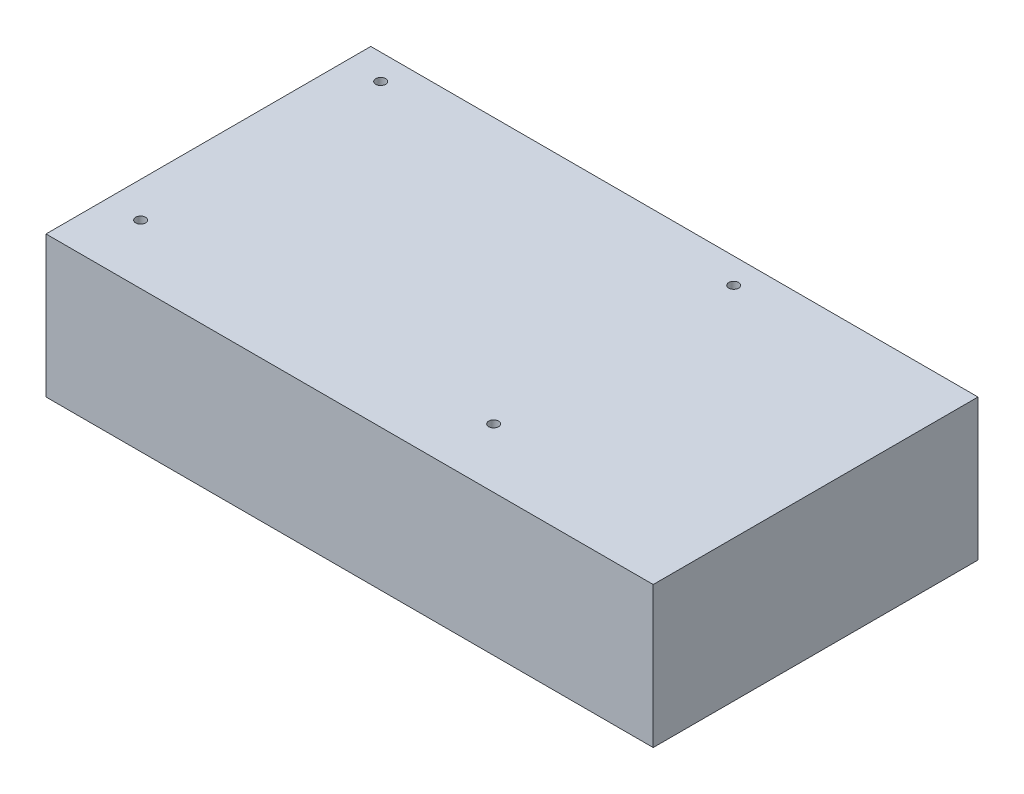
ISO-10303-21;
HEADER;
FILE_DESCRIPTION(('STEP AP214'),'2;1');
FILE_NAME('part.step','',(''),(''),'','','');
FILE_SCHEMA(('AUTOMOTIVE_DESIGN { 1 0 10303 214 1 1 1 1 }'));
ENDSEC;
DATA;
#1=APPLICATION_CONTEXT('core data for automotive mechanical design processes');
#2=APPLICATION_PROTOCOL_DEFINITION('international standard','automotive_design',2000,#1);
#3=PRODUCT_CONTEXT('',#1,'mechanical');
#4=PRODUCT('Part','Part','',(#3));
#5=PRODUCT_RELATED_PRODUCT_CATEGORY('part','',(#4));
#6=PRODUCT_DEFINITION_FORMATION('','',#4);
#7=PRODUCT_DEFINITION_CONTEXT('part definition',#1,'design');
#8=PRODUCT_DEFINITION('design','',#6,#7);
#9=PRODUCT_DEFINITION_SHAPE('','',#8);
#10=(LENGTH_UNIT() NAMED_UNIT(*) SI_UNIT(.MILLI.,.METRE.));
#11=(NAMED_UNIT(*) PLANE_ANGLE_UNIT() SI_UNIT($,.RADIAN.));
#12=(NAMED_UNIT(*) SI_UNIT($,.STERADIAN.) SOLID_ANGLE_UNIT());
#13=UNCERTAINTY_MEASURE_WITH_UNIT(LENGTH_MEASURE(1.E-05),#10,'distance_accuracy_value','');
#14=(GEOMETRIC_REPRESENTATION_CONTEXT(3) GLOBAL_UNCERTAINTY_ASSIGNED_CONTEXT((#13)) GLOBAL_UNIT_ASSIGNED_CONTEXT((#10,
#11,#12)) REPRESENTATION_CONTEXT('',''));
#15=CARTESIAN_POINT('',(0.,0.,0.));
#16=DIRECTION('',(0.,0.,1.));
#17=DIRECTION('',(1.,0.,0.));
#18=AXIS2_PLACEMENT_3D('',#15,#16,#17);
#19=CARTESIAN_POINT('',(-56.686460807601,50.,-50.813539192399));
#20=DIRECTION('',(1.,0.,0.));
#21=DIRECTION('',(0.,0.,-1.));
#22=AXIS2_PLACEMENT_3D('',#19,#20,#21);
#23=PLANE('',#22);
#24=DIRECTION('',(0.,0.,1.));
#25=VECTOR('',#24,1.);
#26=CARTESIAN_POINT('',(-56.686460807601,0.,-50.813539192399));
#27=LINE('',#26,#25);
#28=CARTESIAN_POINT('',(-56.686460807601,0.,-50.813539192399));
#29=VERTEX_POINT('',#28);
#30=CARTESIAN_POINT('',(-56.686460807601,0.,64.186460807601));
#31=VERTEX_POINT('',#30);
#32=EDGE_CURVE('E98',#29,#31,#27,.T.);
#33=ORIENTED_EDGE('',*,*,#32,.T.);
#34=DIRECTION('',(0.,-1.,0.));
#35=VECTOR('',#34,1.);
#36=CARTESIAN_POINT('',(-56.686460807601,50.,64.186460807601));
#37=LINE('',#36,#35);
#38=CARTESIAN_POINT('',(-56.686460807601,50.,64.186460807601));
#39=VERTEX_POINT('',#38);
#40=EDGE_CURVE('E11',#39,#31,#37,.T.);
#41=ORIENTED_EDGE('',*,*,#40,.F.);
#42=DIRECTION('',(0.,0.,1.));
#43=VECTOR('',#42,1.);
#44=CARTESIAN_POINT('',(-56.686460807601,50.,-50.813539192399));
#45=LINE('',#44,#43);
#46=CARTESIAN_POINT('',(-56.686460807601,50.,-50.813539192399));
#47=VERTEX_POINT('',#46);
#48=EDGE_CURVE('E86',#47,#39,#45,.T.);
#49=ORIENTED_EDGE('',*,*,#48,.F.);
#50=DIRECTION('',(0.,-1.,0.));
#51=VECTOR('',#50,1.);
#52=CARTESIAN_POINT('',(-56.686460807601,50.,-50.813539192399));
#53=LINE('',#52,#51);
#54=EDGE_CURVE('E94',#47,#29,#53,.T.);
#55=ORIENTED_EDGE('',*,*,#54,.T.);
#56=EDGE_LOOP('',(#33,#41,#49,#55));
#57=FACE_BOUND('',#56,.T.);
#58=ADVANCED_FACE('F35',(#57),#23,.F.);
#59=CARTESIAN_POINT('',(-56.686460807601,50.,64.186460807601));
#60=DIRECTION('',(0.,0.,-1.));
#61=DIRECTION('',(-1.,0.,0.));
#62=AXIS2_PLACEMENT_3D('',#59,#60,#61);
#63=PLANE('',#62);
#64=DIRECTION('',(1.,0.,0.));
#65=VECTOR('',#64,1.);
#66=CARTESIAN_POINT('',(-56.686460807601,0.,64.186460807601));
#67=LINE('',#66,#65);
#68=CARTESIAN_POINT('',(158.313539192399,0.,64.186460807601));
#69=VERTEX_POINT('',#68);
#70=EDGE_CURVE('E90',#31,#69,#67,.T.);
#71=ORIENTED_EDGE('',*,*,#70,.T.);
#72=DIRECTION('',(0.,-1.,0.));
#73=VECTOR('',#72,1.);
#74=CARTESIAN_POINT('',(158.313539192399,50.,64.186460807601));
#75=LINE('',#74,#73);
#76=CARTESIAN_POINT('',(158.313539192399,50.,64.186460807601));
#77=VERTEX_POINT('',#76);
#78=EDGE_CURVE('E43',#77,#69,#75,.T.);
#79=ORIENTED_EDGE('',*,*,#78,.F.);
#80=DIRECTION('',(1.,0.,0.));
#81=VECTOR('',#80,1.);
#82=CARTESIAN_POINT('',(-56.686460807601,50.,64.186460807601));
#83=LINE('',#82,#81);
#84=EDGE_CURVE('E81',#39,#77,#83,.T.);
#85=ORIENTED_EDGE('',*,*,#84,.F.);
#86=ORIENTED_EDGE('',*,*,#40,.T.);
#87=EDGE_LOOP('',(#71,#79,#85,#86));
#88=FACE_BOUND('',#87,.T.);
#89=ADVANCED_FACE('F89',(#88),#63,.F.);
#90=CARTESIAN_POINT('',(158.313539192399,50.,-50.813539192399));
#91=DIRECTION('',(-1.,0.,0.));
#92=DIRECTION('',(0.,0.,1.));
#93=AXIS2_PLACEMENT_3D('',#90,#91,#92);
#94=PLANE('',#93);
#95=DIRECTION('',(0.,0.,-1.));
#96=VECTOR('',#95,1.);
#97=CARTESIAN_POINT('',(158.313539192399,0.,-50.813539192399));
#98=LINE('',#97,#96);
#99=CARTESIAN_POINT('',(158.313539192399,0.,-50.813539192399));
#100=VERTEX_POINT('',#99);
#101=EDGE_CURVE('E68',#69,#100,#98,.T.);
#102=ORIENTED_EDGE('',*,*,#101,.T.);
#103=DIRECTION('',(0.,-1.,0.));
#104=VECTOR('',#103,1.);
#105=CARTESIAN_POINT('',(158.313539192399,50.,-50.813539192399));
#106=LINE('',#105,#104);
#107=CARTESIAN_POINT('',(158.313539192399,50.,-50.813539192399));
#108=VERTEX_POINT('',#107);
#109=EDGE_CURVE('E91',#108,#100,#106,.T.);
#110=ORIENTED_EDGE('',*,*,#109,.F.);
#111=DIRECTION('',(0.,0.,-1.));
#112=VECTOR('',#111,1.);
#113=CARTESIAN_POINT('',(158.313539192399,50.,-50.813539192399));
#114=LINE('',#113,#112);
#115=EDGE_CURVE('E84',#77,#108,#114,.T.);
#116=ORIENTED_EDGE('',*,*,#115,.F.);
#117=ORIENTED_EDGE('',*,*,#78,.T.);
#118=EDGE_LOOP('',(#102,#110,#116,#117));
#119=FACE_BOUND('',#118,.T.);
#120=ADVANCED_FACE('F92',(#119),#94,.F.);
#121=CARTESIAN_POINT('',(-56.686460807601,50.,-50.813539192399));
#122=DIRECTION('',(0.,0.,1.));
#123=DIRECTION('',(1.,0.,0.));
#124=AXIS2_PLACEMENT_3D('',#121,#122,#123);
#125=PLANE('',#124);
#126=DIRECTION('',(-1.,0.,0.));
#127=VECTOR('',#126,1.);
#128=CARTESIAN_POINT('',(-56.686460807601,0.,-50.813539192399));
#129=LINE('',#128,#127);
#130=EDGE_CURVE('E74',#100,#29,#129,.T.);
#131=ORIENTED_EDGE('',*,*,#130,.T.);
#132=ORIENTED_EDGE('',*,*,#54,.F.);
#133=DIRECTION('',(-1.,0.,0.));
#134=VECTOR('',#133,1.);
#135=CARTESIAN_POINT('',(-56.686460807601,50.,-50.813539192399));
#136=LINE('',#135,#134);
#137=EDGE_CURVE('E51',#108,#47,#136,.T.);
#138=ORIENTED_EDGE('',*,*,#137,.F.);
#139=ORIENTED_EDGE('',*,*,#109,.T.);
#140=EDGE_LOOP('',(#131,#132,#138,#139));
#141=FACE_BOUND('',#140,.T.);
#142=ADVANCED_FACE('F106',(#141),#125,.F.);
#143=CARTESIAN_POINT('',(0.,50.,0.));
#144=DIRECTION('',(0.,1.,0.));
#145=DIRECTION('',(0.,0.,1.));
#146=AXIS2_PLACEMENT_3D('',#143,#144,#145);
#147=PLANE('',#146);
#148=CARTESIAN_POINT('',(80.813539192399,50.,-41.813539192399));
#149=DIRECTION('',(0.,1.,0.));
#150=DIRECTION('',(0.,0.,1.));
#151=AXIS2_PLACEMENT_3D('',#148,#149,#150);
#152=CIRCLE('',#151,1.75);
#153=CARTESIAN_POINT('',(80.813539192399,50.,-40.0635391923991));
#154=VERTEX_POINT('',#153);
#155=EDGE_CURVE('E118',#154,#154,#152,.T.);
#156=ORIENTED_EDGE('',*,*,#155,.F.);
#157=EDGE_LOOP('',(#156));
#158=FACE_BOUND('',#157,.T.);
#159=CARTESIAN_POINT('',(80.813539192399,50.,43.186460807601));
#160=DIRECTION('',(0.,1.,0.));
#161=DIRECTION('',(0.,0.,1.));
#162=AXIS2_PLACEMENT_3D('',#159,#160,#161);
#163=CIRCLE('',#162,1.75);
#164=CARTESIAN_POINT('',(80.813539192399,50.,44.936460807601));
#165=VERTEX_POINT('',#164);
#166=EDGE_CURVE('E124',#165,#165,#163,.T.);
#167=ORIENTED_EDGE('',*,*,#166,.F.);
#168=EDGE_LOOP('',(#167));
#169=FACE_BOUND('',#168,.T.);
#170=CARTESIAN_POINT('',(-44.186460807601,50.,43.186460807601));
#171=DIRECTION('',(0.,1.,0.));
#172=DIRECTION('',(0.,0.,1.));
#173=AXIS2_PLACEMENT_3D('',#170,#171,#172);
#174=CIRCLE('',#173,1.75);
#175=CARTESIAN_POINT('',(-44.186460807601,50.,44.936460807601));
#176=VERTEX_POINT('',#175);
#177=EDGE_CURVE('E130',#176,#176,#174,.T.);
#178=ORIENTED_EDGE('',*,*,#177,.F.);
#179=EDGE_LOOP('',(#178));
#180=FACE_BOUND('',#179,.T.);
#181=CARTESIAN_POINT('',(-44.186460807601,50.,-41.813539192399));
#182=DIRECTION('',(0.,1.,0.));
#183=DIRECTION('',(0.,0.,1.));
#184=AXIS2_PLACEMENT_3D('',#181,#182,#183);
#185=CIRCLE('',#184,1.75);
#186=CARTESIAN_POINT('',(-44.186460807601,50.,-40.063539192399));
#187=VERTEX_POINT('',#186);
#188=EDGE_CURVE('E112',#187,#187,#185,.T.);
#189=ORIENTED_EDGE('',*,*,#188,.F.);
#190=EDGE_LOOP('',(#189));
#191=FACE_BOUND('',#190,.T.);
#192=ORIENTED_EDGE('',*,*,#48,.T.);
#193=ORIENTED_EDGE('',*,*,#84,.T.);
#194=ORIENTED_EDGE('',*,*,#115,.T.);
#195=ORIENTED_EDGE('',*,*,#137,.T.);
#196=EDGE_LOOP('',(#192,#193,#194,#195));
#197=FACE_BOUND('',#196,.T.);
#198=ADVANCED_FACE('F82',(#158,#169,#180,#191,#197),#147,.T.);
#199=CARTESIAN_POINT('',(0.,0.,0.));
#200=DIRECTION('',(0.,1.,0.));
#201=DIRECTION('',(0.,0.,1.));
#202=AXIS2_PLACEMENT_3D('',#199,#200,#201);
#203=PLANE('',#202);
#204=ORIENTED_EDGE('',*,*,#32,.F.);
#205=ORIENTED_EDGE('',*,*,#130,.F.);
#206=ORIENTED_EDGE('',*,*,#101,.F.);
#207=ORIENTED_EDGE('',*,*,#70,.F.);
#208=EDGE_LOOP('',(#204,#205,#206,#207));
#209=FACE_BOUND('',#208,.T.);
#210=ADVANCED_FACE('F109',(#209),#203,.F.);
#211=CARTESIAN_POINT('',(-44.186460807601,45.,-41.813539192399));
#212=DIRECTION('',(0.,1.,0.));
#213=DIRECTION('',(0.,0.,1.));
#214=AXIS2_PLACEMENT_3D('',#211,#212,#213);
#215=CYLINDRICAL_SURFACE('',#214,1.75);
#216=CARTESIAN_POINT('',(-44.186460807601,45.,-41.813539192399));
#217=DIRECTION('',(0.,1.,0.));
#218=DIRECTION('',(0.,0.,1.));
#219=AXIS2_PLACEMENT_3D('',#216,#217,#218);
#220=CIRCLE('',#219,1.75);
#221=CARTESIAN_POINT('',(-44.186460807601,45.,-40.063539192399));
#222=VERTEX_POINT('',#221);
#223=EDGE_CURVE('E101',#222,#222,#220,.T.);
#224=ORIENTED_EDGE('',*,*,#223,.F.);
#225=EDGE_LOOP('',(#224));
#226=FACE_BOUND('',#225,.T.);
#227=ORIENTED_EDGE('',*,*,#188,.T.);
#228=EDGE_LOOP('',(#227));
#229=FACE_BOUND('',#228,.T.);
#230=ADVANCED_FACE('F151',(#226,#229),#215,.F.);
#231=CARTESIAN_POINT('',(-44.186460807601,45.,-41.813539192399));
#232=DIRECTION('',(0.,1.,0.));
#233=DIRECTION('',(0.,0.,1.));
#234=AXIS2_PLACEMENT_3D('',#231,#232,#233);
#235=PLANE('',#234);
#236=ORIENTED_EDGE('',*,*,#223,.T.);
#237=EDGE_LOOP('',(#236));
#238=FACE_BOUND('',#237,.T.);
#239=ADVANCED_FACE('F141',(#238),#235,.T.);
#240=CARTESIAN_POINT('',(-44.186460807601,45.,43.186460807601));
#241=DIRECTION('',(0.,1.,0.));
#242=DIRECTION('',(0.,0.,1.));
#243=AXIS2_PLACEMENT_3D('',#240,#241,#242);
#244=CYLINDRICAL_SURFACE('',#243,1.75);
#245=CARTESIAN_POINT('',(-44.186460807601,45.,43.186460807601));
#246=DIRECTION('',(0.,1.,0.));
#247=DIRECTION('',(0.,0.,1.));
#248=AXIS2_PLACEMENT_3D('',#245,#246,#247);
#249=CIRCLE('',#248,1.75);
#250=CARTESIAN_POINT('',(-44.186460807601,45.,44.936460807601));
#251=VERTEX_POINT('',#250);
#252=EDGE_CURVE('E115',#251,#251,#249,.T.);
#253=ORIENTED_EDGE('',*,*,#252,.F.);
#254=EDGE_LOOP('',(#253));
#255=FACE_BOUND('',#254,.T.);
#256=ORIENTED_EDGE('',*,*,#177,.T.);
#257=EDGE_LOOP('',(#256));
#258=FACE_BOUND('',#257,.T.);
#259=ADVANCED_FACE('F138',(#255,#258),#244,.F.);
#260=CARTESIAN_POINT('',(-44.186460807601,45.,43.186460807601));
#261=DIRECTION('',(0.,1.,0.));
#262=DIRECTION('',(0.,0.,1.));
#263=AXIS2_PLACEMENT_3D('',#260,#261,#262);
#264=PLANE('',#263);
#265=ORIENTED_EDGE('',*,*,#252,.T.);
#266=EDGE_LOOP('',(#265));
#267=FACE_BOUND('',#266,.T.);
#268=ADVANCED_FACE('F136',(#267),#264,.T.);
#269=CARTESIAN_POINT('',(80.813539192399,45.,43.186460807601));
#270=DIRECTION('',(0.,1.,0.));
#271=DIRECTION('',(0.,0.,1.));
#272=AXIS2_PLACEMENT_3D('',#269,#270,#271);
#273=CYLINDRICAL_SURFACE('',#272,1.75);
#274=CARTESIAN_POINT('',(80.813539192399,45.,43.186460807601));
#275=DIRECTION('',(0.,1.,0.));
#276=DIRECTION('',(0.,0.,1.));
#277=AXIS2_PLACEMENT_3D('',#274,#275,#276);
#278=CIRCLE('',#277,1.75);
#279=CARTESIAN_POINT('',(80.813539192399,45.,44.936460807601));
#280=VERTEX_POINT('',#279);
#281=EDGE_CURVE('E127',#280,#280,#278,.T.);
#282=ORIENTED_EDGE('',*,*,#281,.F.);
#283=EDGE_LOOP('',(#282));
#284=FACE_BOUND('',#283,.T.);
#285=ORIENTED_EDGE('',*,*,#166,.T.);
#286=EDGE_LOOP('',(#285));
#287=FACE_BOUND('',#286,.T.);
#288=ADVANCED_FACE('F211',(#284,#287),#273,.F.);
#289=CARTESIAN_POINT('',(80.813539192399,45.,43.186460807601));
#290=DIRECTION('',(0.,1.,0.));
#291=DIRECTION('',(0.,0.,1.));
#292=AXIS2_PLACEMENT_3D('',#289,#290,#291);
#293=PLANE('',#292);
#294=ORIENTED_EDGE('',*,*,#281,.T.);
#295=EDGE_LOOP('',(#294));
#296=FACE_BOUND('',#295,.T.);
#297=ADVANCED_FACE('F219',(#296),#293,.T.);
#298=CARTESIAN_POINT('',(80.813539192399,45.,-41.813539192399));
#299=DIRECTION('',(0.,1.,0.));
#300=DIRECTION('',(0.,0.,1.));
#301=AXIS2_PLACEMENT_3D('',#298,#299,#300);
#302=CYLINDRICAL_SURFACE('',#301,1.75);
#303=CARTESIAN_POINT('',(80.813539192399,45.,-41.813539192399));
#304=DIRECTION('',(0.,1.,0.));
#305=DIRECTION('',(0.,0.,1.));
#306=AXIS2_PLACEMENT_3D('',#303,#304,#305);
#307=CIRCLE('',#306,1.75);
#308=CARTESIAN_POINT('',(80.813539192399,45.,-40.0635391923991));
#309=VERTEX_POINT('',#308);
#310=EDGE_CURVE('E121',#309,#309,#307,.T.);
#311=ORIENTED_EDGE('',*,*,#310,.F.);
#312=EDGE_LOOP('',(#311));
#313=FACE_BOUND('',#312,.T.);
#314=ORIENTED_EDGE('',*,*,#155,.T.);
#315=EDGE_LOOP('',(#314));
#316=FACE_BOUND('',#315,.T.);
#317=ADVANCED_FACE('F228',(#313,#316),#302,.F.);
#318=CARTESIAN_POINT('',(80.813539192399,45.,-41.813539192399));
#319=DIRECTION('',(0.,1.,0.));
#320=DIRECTION('',(0.,0.,1.));
#321=AXIS2_PLACEMENT_3D('',#318,#319,#320);
#322=PLANE('',#321);
#323=ORIENTED_EDGE('',*,*,#310,.T.);
#324=EDGE_LOOP('',(#323));
#325=FACE_BOUND('',#324,.T.);
#326=ADVANCED_FACE('F237',(#325),#322,.T.);
#327=CLOSED_SHELL('',(#58,#89,#120,#142,#198,#210,#230,#239,#259,#268,#288,#297,#317,#326));
#328=MANIFOLD_SOLID_BREP('B2',#327);
#329=ADVANCED_BREP_SHAPE_REPRESENTATION('',(#18,#328),#14);
#330=SHAPE_DEFINITION_REPRESENTATION(#9,#329);
ENDSEC;
END-ISO-10303-21;
